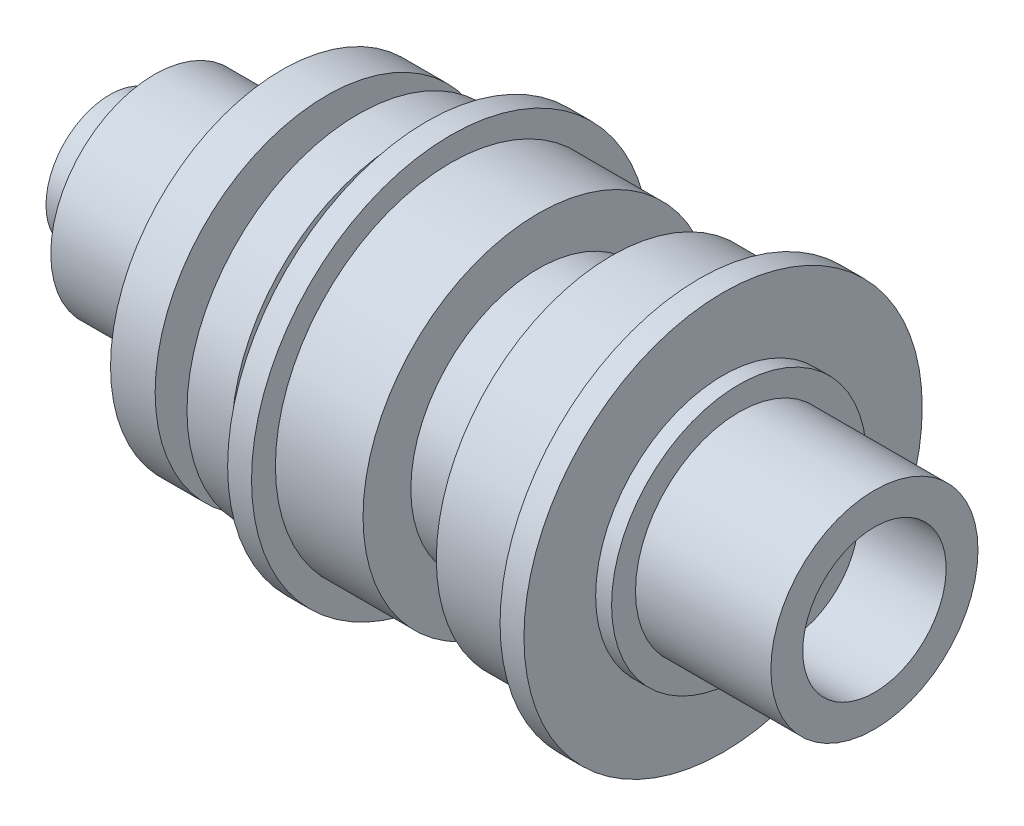
ISO-10303-21;
HEADER;
FILE_DESCRIPTION(('STEP AP214'),'2;1');
FILE_NAME('part.step','',(''),(''),'','','');
FILE_SCHEMA(('AUTOMOTIVE_DESIGN { 1 0 10303 214 1 1 1 1 }'));
ENDSEC;
DATA;
#1=APPLICATION_CONTEXT('core data for automotive mechanical design processes');
#2=APPLICATION_PROTOCOL_DEFINITION('international standard','automotive_design',2000,#1);
#3=PRODUCT_CONTEXT('',#1,'mechanical');
#4=PRODUCT('Part','Part','',(#3));
#5=PRODUCT_RELATED_PRODUCT_CATEGORY('part','',(#4));
#6=PRODUCT_DEFINITION_FORMATION('','',#4);
#7=PRODUCT_DEFINITION_CONTEXT('part definition',#1,'design');
#8=PRODUCT_DEFINITION('design','',#6,#7);
#9=PRODUCT_DEFINITION_SHAPE('','',#8);
#10=(LENGTH_UNIT() NAMED_UNIT(*) SI_UNIT(.MILLI.,.METRE.));
#11=(NAMED_UNIT(*) PLANE_ANGLE_UNIT() SI_UNIT($,.RADIAN.));
#12=(NAMED_UNIT(*) SI_UNIT($,.STERADIAN.) SOLID_ANGLE_UNIT());
#13=UNCERTAINTY_MEASURE_WITH_UNIT(LENGTH_MEASURE(1.E-05),#10,'distance_accuracy_value','');
#14=(GEOMETRIC_REPRESENTATION_CONTEXT(3) GLOBAL_UNCERTAINTY_ASSIGNED_CONTEXT((#13)) GLOBAL_UNIT_ASSIGNED_CONTEXT((#10,
#11,#12)) REPRESENTATION_CONTEXT('',''));
#15=CARTESIAN_POINT('',(0.,0.,0.));
#16=DIRECTION('',(0.,0.,1.));
#17=DIRECTION('',(1.,0.,0.));
#18=AXIS2_PLACEMENT_3D('',#15,#16,#17);
#19=CARTESIAN_POINT('',(-10.6952002257775,0.,0.));
#20=DIRECTION('',(-1.,0.,0.));
#21=DIRECTION('',(0.,0.,1.));
#22=AXIS2_PLACEMENT_3D('',#19,#20,#21);
#23=CYLINDRICAL_SURFACE('',#22,4.);
#24=CARTESIAN_POINT('',(0.,0.,0.));
#25=DIRECTION('',(-1.,0.,0.));
#26=DIRECTION('',(0.,0.,1.));
#27=AXIS2_PLACEMENT_3D('',#24,#25,#26);
#28=CIRCLE('',#27,4.);
#29=CARTESIAN_POINT('',(0.,0.,4.));
#30=VERTEX_POINT('',#29);
#31=EDGE_CURVE('E119',#30,#30,#28,.T.);
#32=ORIENTED_EDGE('',*,*,#31,.F.);
#33=EDGE_LOOP('',(#32));
#34=FACE_BOUND('',#33,.T.);
#35=CARTESIAN_POINT('',(2.8,0.,0.));
#36=DIRECTION('',(-1.,0.,0.));
#37=DIRECTION('',(0.,0.,1.));
#38=AXIS2_PLACEMENT_3D('',#35,#36,#37);
#39=CIRCLE('',#38,4.);
#40=CARTESIAN_POINT('',(2.8,0.,4.));
#41=VERTEX_POINT('',#40);
#42=EDGE_CURVE('E10',#41,#41,#39,.T.);
#43=ORIENTED_EDGE('',*,*,#42,.T.);
#44=EDGE_LOOP('',(#43));
#45=FACE_BOUND('',#44,.T.);
#46=ADVANCED_FACE('F31',(#34,#45),#23,.T.);
#47=CARTESIAN_POINT('',(2.8,6.5,0.));
#48=DIRECTION('',(1.,0.,0.));
#49=DIRECTION('',(0.,0.,-1.));
#50=AXIS2_PLACEMENT_3D('',#47,#48,#49);
#51=PLANE('',#50);
#52=ORIENTED_EDGE('',*,*,#42,.F.);
#53=EDGE_LOOP('',(#52));
#54=FACE_BOUND('',#53,.T.);
#55=CARTESIAN_POINT('',(2.8,0.,0.));
#56=DIRECTION('',(-1.,0.,0.));
#57=DIRECTION('',(0.,0.,1.));
#58=AXIS2_PLACEMENT_3D('',#55,#56,#57);
#59=CIRCLE('',#58,6.5);
#60=CARTESIAN_POINT('',(2.8,0.,6.5));
#61=VERTEX_POINT('',#60);
#62=EDGE_CURVE('E37',#61,#61,#59,.T.);
#63=ORIENTED_EDGE('',*,*,#62,.T.);
#64=EDGE_LOOP('',(#63));
#65=FACE_BOUND('',#64,.T.);
#66=ADVANCED_FACE('F126',(#54,#65),#51,.F.);
#67=CARTESIAN_POINT('',(-10.6952002257775,0.,0.));
#68=DIRECTION('',(-1.,0.,0.));
#69=DIRECTION('',(0.,0.,1.));
#70=AXIS2_PLACEMENT_3D('',#67,#68,#69);
#71=CYLINDRICAL_SURFACE('',#70,6.5);
#72=ORIENTED_EDGE('',*,*,#62,.F.);
#73=EDGE_LOOP('',(#72));
#74=FACE_BOUND('',#73,.T.);
#75=CARTESIAN_POINT('',(10.8,0.,0.));
#76=DIRECTION('',(-1.,0.,0.));
#77=DIRECTION('',(0.,0.,1.));
#78=AXIS2_PLACEMENT_3D('',#75,#76,#77);
#79=CIRCLE('',#78,6.5);
#80=CARTESIAN_POINT('',(10.8,0.,6.5));
#81=VERTEX_POINT('',#80);
#82=EDGE_CURVE('E41',#81,#81,#79,.T.);
#83=ORIENTED_EDGE('',*,*,#82,.T.);
#84=EDGE_LOOP('',(#83));
#85=FACE_BOUND('',#84,.T.);
#86=ADVANCED_FACE('F130',(#74,#85),#71,.T.);
#87=CARTESIAN_POINT('',(10.8,6.5,0.));
#88=DIRECTION('',(1.,0.,0.));
#89=DIRECTION('',(0.,0.,-1.));
#90=AXIS2_PLACEMENT_3D('',#87,#88,#89);
#91=PLANE('',#90);
#92=ORIENTED_EDGE('',*,*,#82,.F.);
#93=EDGE_LOOP('',(#92));
#94=FACE_BOUND('',#93,.T.);
#95=CARTESIAN_POINT('',(10.8,0.,0.));
#96=DIRECTION('',(-1.,0.,0.));
#97=DIRECTION('',(0.,0.,1.));
#98=AXIS2_PLACEMENT_3D('',#95,#96,#97);
#99=CIRCLE('',#98,10.75);
#100=CARTESIAN_POINT('',(10.8,0.,10.75));
#101=VERTEX_POINT('',#100);
#102=EDGE_CURVE('E45',#101,#101,#99,.T.);
#103=ORIENTED_EDGE('',*,*,#102,.T.);
#104=EDGE_LOOP('',(#103));
#105=FACE_BOUND('',#104,.T.);
#106=ADVANCED_FACE('F135',(#94,#105),#91,.F.);
#107=CARTESIAN_POINT('',(-10.6952002257775,0.,0.));
#108=DIRECTION('',(-1.,0.,0.));
#109=DIRECTION('',(0.,0.,1.));
#110=AXIS2_PLACEMENT_3D('',#107,#108,#109);
#111=CYLINDRICAL_SURFACE('',#110,10.75);
#112=ORIENTED_EDGE('',*,*,#102,.F.);
#113=EDGE_LOOP('',(#112));
#114=FACE_BOUND('',#113,.T.);
#115=CARTESIAN_POINT('',(13.6,0.,0.));
#116=DIRECTION('',(-1.,0.,0.));
#117=DIRECTION('',(0.,0.,1.));
#118=AXIS2_PLACEMENT_3D('',#115,#116,#117);
#119=CIRCLE('',#118,10.75);
#120=CARTESIAN_POINT('',(13.6,0.,10.75));
#121=VERTEX_POINT('',#120);
#122=EDGE_CURVE('E50',#121,#121,#119,.T.);
#123=ORIENTED_EDGE('',*,*,#122,.T.);
#124=EDGE_LOOP('',(#123));
#125=FACE_BOUND('',#124,.T.);
#126=ADVANCED_FACE('F141',(#114,#125),#111,.T.);
#127=CARTESIAN_POINT('',(13.6,10.75,0.));
#128=DIRECTION('',(-1.,0.,0.));
#129=DIRECTION('',(0.,0.,1.));
#130=AXIS2_PLACEMENT_3D('',#127,#128,#129);
#131=PLANE('',#130);
#132=ORIENTED_EDGE('',*,*,#122,.F.);
#133=EDGE_LOOP('',(#132));
#134=FACE_BOUND('',#133,.T.);
#135=CARTESIAN_POINT('',(13.6,0.,0.));
#136=DIRECTION('',(-1.,0.,0.));
#137=DIRECTION('',(0.,0.,1.));
#138=AXIS2_PLACEMENT_3D('',#135,#136,#137);
#139=CIRCLE('',#138,4.);
#140=CARTESIAN_POINT('',(13.6,0.,4.));
#141=VERTEX_POINT('',#140);
#142=EDGE_CURVE('E53',#141,#141,#139,.T.);
#143=ORIENTED_EDGE('',*,*,#142,.T.);
#144=EDGE_LOOP('',(#143));
#145=FACE_BOUND('',#144,.T.);
#146=ADVANCED_FACE('F145',(#134,#145),#131,.F.);
#147=CARTESIAN_POINT('',(-10.6952002257775,0.,0.));
#148=DIRECTION('',(-1.,0.,0.));
#149=DIRECTION('',(0.,0.,1.));
#150=AXIS2_PLACEMENT_3D('',#147,#148,#149);
#151=CYLINDRICAL_SURFACE('',#150,4.);
#152=ORIENTED_EDGE('',*,*,#142,.F.);
#153=EDGE_LOOP('',(#152));
#154=FACE_BOUND('',#153,.T.);
#155=CARTESIAN_POINT('',(15.6,0.,0.));
#156=DIRECTION('',(-1.,0.,0.));
#157=DIRECTION('',(0.,0.,1.));
#158=AXIS2_PLACEMENT_3D('',#155,#156,#157);
#159=CIRCLE('',#158,4.);
#160=CARTESIAN_POINT('',(15.6,0.,4.));
#161=VERTEX_POINT('',#160);
#162=EDGE_CURVE('E56',#161,#161,#159,.T.);
#163=ORIENTED_EDGE('',*,*,#162,.T.);
#164=EDGE_LOOP('',(#163));
#165=FACE_BOUND('',#164,.T.);
#166=ADVANCED_FACE('F149',(#154,#165),#151,.T.);
#167=CARTESIAN_POINT('',(15.6,4.,0.));
#168=DIRECTION('',(1.,0.,0.));
#169=DIRECTION('',(0.,0.,-1.));
#170=AXIS2_PLACEMENT_3D('',#167,#168,#169);
#171=PLANE('',#170);
#172=ORIENTED_EDGE('',*,*,#162,.F.);
#173=EDGE_LOOP('',(#172));
#174=FACE_BOUND('',#173,.T.);
#175=CARTESIAN_POINT('',(15.6,0.,0.));
#176=DIRECTION('',(-1.,0.,0.));
#177=DIRECTION('',(0.,0.,1.));
#178=AXIS2_PLACEMENT_3D('',#175,#176,#177);
#179=CIRCLE('',#178,10.75);
#180=CARTESIAN_POINT('',(15.6,0.,10.75));
#181=VERTEX_POINT('',#180);
#182=EDGE_CURVE('E59',#181,#181,#179,.T.);
#183=ORIENTED_EDGE('',*,*,#182,.T.);
#184=EDGE_LOOP('',(#183));
#185=FACE_BOUND('',#184,.T.);
#186=ADVANCED_FACE('F153',(#174,#185),#171,.F.);
#187=CARTESIAN_POINT('',(-10.6952002257775,0.,0.));
#188=DIRECTION('',(-1.,0.,0.));
#189=DIRECTION('',(0.,0.,1.));
#190=AXIS2_PLACEMENT_3D('',#187,#188,#189);
#191=CYLINDRICAL_SURFACE('',#190,10.75);
#192=ORIENTED_EDGE('',*,*,#182,.F.);
#193=EDGE_LOOP('',(#192));
#194=FACE_BOUND('',#193,.T.);
#195=CARTESIAN_POINT('',(18.4,0.,0.));
#196=DIRECTION('',(-1.,0.,0.));
#197=DIRECTION('',(0.,0.,1.));
#198=AXIS2_PLACEMENT_3D('',#195,#196,#197);
#199=CIRCLE('',#198,10.75);
#200=CARTESIAN_POINT('',(18.4,0.,10.75));
#201=VERTEX_POINT('',#200);
#202=EDGE_CURVE('E62',#201,#201,#199,.T.);
#203=ORIENTED_EDGE('',*,*,#202,.T.);
#204=EDGE_LOOP('',(#203));
#205=FACE_BOUND('',#204,.T.);
#206=ADVANCED_FACE('F157',(#194,#205),#191,.T.);
#207=CARTESIAN_POINT('',(18.4,10.75,0.));
#208=DIRECTION('',(-1.,0.,0.));
#209=DIRECTION('',(0.,0.,1.));
#210=AXIS2_PLACEMENT_3D('',#207,#208,#209);
#211=PLANE('',#210);
#212=ORIENTED_EDGE('',*,*,#202,.F.);
#213=EDGE_LOOP('',(#212));
#214=FACE_BOUND('',#213,.T.);
#215=CARTESIAN_POINT('',(18.4,0.,0.));
#216=DIRECTION('',(-1.,0.,0.));
#217=DIRECTION('',(0.,0.,1.));
#218=AXIS2_PLACEMENT_3D('',#215,#216,#217);
#219=CIRCLE('',#218,8.);
#220=CARTESIAN_POINT('',(18.4,0.,8.));
#221=VERTEX_POINT('',#220);
#222=EDGE_CURVE('E65',#221,#221,#219,.T.);
#223=ORIENTED_EDGE('',*,*,#222,.T.);
#224=EDGE_LOOP('',(#223));
#225=FACE_BOUND('',#224,.T.);
#226=ADVANCED_FACE('F161',(#214,#225),#211,.F.);
#227=CARTESIAN_POINT('',(-10.6952002257775,0.,0.));
#228=DIRECTION('',(-1.,0.,0.));
#229=DIRECTION('',(0.,0.,1.));
#230=AXIS2_PLACEMENT_3D('',#227,#228,#229);
#231=CYLINDRICAL_SURFACE('',#230,8.);
#232=ORIENTED_EDGE('',*,*,#222,.F.);
#233=EDGE_LOOP('',(#232));
#234=FACE_BOUND('',#233,.T.);
#235=CARTESIAN_POINT('',(19.9,0.,0.));
#236=DIRECTION('',(-1.,0.,0.));
#237=DIRECTION('',(0.,0.,1.));
#238=AXIS2_PLACEMENT_3D('',#235,#236,#237);
#239=CIRCLE('',#238,8.);
#240=CARTESIAN_POINT('',(19.9,0.,8.));
#241=VERTEX_POINT('',#240);
#242=EDGE_CURVE('E68',#241,#241,#239,.T.);
#243=ORIENTED_EDGE('',*,*,#242,.T.);
#244=EDGE_LOOP('',(#243));
#245=FACE_BOUND('',#244,.T.);
#246=ADVANCED_FACE('F165',(#234,#245),#231,.T.);
#247=CARTESIAN_POINT('',(19.9,8.,0.));
#248=DIRECTION('',(1.,0.,0.));
#249=DIRECTION('',(0.,0.,-1.));
#250=AXIS2_PLACEMENT_3D('',#247,#248,#249);
#251=PLANE('',#250);
#252=ORIENTED_EDGE('',*,*,#242,.F.);
#253=EDGE_LOOP('',(#252));
#254=FACE_BOUND('',#253,.T.);
#255=CARTESIAN_POINT('',(19.9,0.,0.));
#256=DIRECTION('',(-1.,0.,0.));
#257=DIRECTION('',(0.,0.,1.));
#258=AXIS2_PLACEMENT_3D('',#255,#256,#257);
#259=CIRCLE('',#258,12.5);
#260=CARTESIAN_POINT('',(19.9,0.,12.5));
#261=VERTEX_POINT('',#260);
#262=EDGE_CURVE('E71',#261,#261,#259,.T.);
#263=ORIENTED_EDGE('',*,*,#262,.T.);
#264=EDGE_LOOP('',(#263));
#265=FACE_BOUND('',#264,.T.);
#266=ADVANCED_FACE('F169',(#254,#265),#251,.F.);
#267=CARTESIAN_POINT('',(-10.6952002257775,0.,0.));
#268=DIRECTION('',(-1.,0.,0.));
#269=DIRECTION('',(0.,0.,1.));
#270=AXIS2_PLACEMENT_3D('',#267,#268,#269);
#271=CYLINDRICAL_SURFACE('',#270,12.5);
#272=ORIENTED_EDGE('',*,*,#262,.F.);
#273=EDGE_LOOP('',(#272));
#274=FACE_BOUND('',#273,.T.);
#275=CARTESIAN_POINT('',(21.4,0.,0.));
#276=DIRECTION('',(-1.,0.,0.));
#277=DIRECTION('',(0.,0.,1.));
#278=AXIS2_PLACEMENT_3D('',#275,#276,#277);
#279=CIRCLE('',#278,12.5);
#280=CARTESIAN_POINT('',(21.4,0.,12.5));
#281=VERTEX_POINT('',#280);
#282=EDGE_CURVE('E74',#281,#281,#279,.T.);
#283=ORIENTED_EDGE('',*,*,#282,.T.);
#284=EDGE_LOOP('',(#283));
#285=FACE_BOUND('',#284,.T.);
#286=ADVANCED_FACE('F173',(#274,#285),#271,.T.);
#287=CARTESIAN_POINT('',(21.4,12.5,0.));
#288=DIRECTION('',(-1.,0.,0.));
#289=DIRECTION('',(0.,0.,1.));
#290=AXIS2_PLACEMENT_3D('',#287,#288,#289);
#291=PLANE('',#290);
#292=ORIENTED_EDGE('',*,*,#282,.F.);
#293=EDGE_LOOP('',(#292));
#294=FACE_BOUND('',#293,.T.);
#295=CARTESIAN_POINT('',(21.4,0.,0.));
#296=DIRECTION('',(-1.,0.,0.));
#297=DIRECTION('',(0.,0.,1.));
#298=AXIS2_PLACEMENT_3D('',#295,#296,#297);
#299=CIRCLE('',#298,11.);
#300=CARTESIAN_POINT('',(21.4,0.,11.));
#301=VERTEX_POINT('',#300);
#302=EDGE_CURVE('E77',#301,#301,#299,.T.);
#303=ORIENTED_EDGE('',*,*,#302,.T.);
#304=EDGE_LOOP('',(#303));
#305=FACE_BOUND('',#304,.T.);
#306=ADVANCED_FACE('F177',(#294,#305),#291,.F.);
#307=CARTESIAN_POINT('',(-10.6952002257775,0.,0.));
#308=DIRECTION('',(-1.,0.,0.));
#309=DIRECTION('',(0.,0.,1.));
#310=AXIS2_PLACEMENT_3D('',#307,#308,#309);
#311=CYLINDRICAL_SURFACE('',#310,11.);
#312=ORIENTED_EDGE('',*,*,#302,.F.);
#313=EDGE_LOOP('',(#312));
#314=FACE_BOUND('',#313,.T.);
#315=CARTESIAN_POINT('',(26.9,0.,0.));
#316=DIRECTION('',(-1.,0.,0.));
#317=DIRECTION('',(0.,0.,1.));
#318=AXIS2_PLACEMENT_3D('',#315,#316,#317);
#319=CIRCLE('',#318,11.);
#320=CARTESIAN_POINT('',(26.9,0.,11.));
#321=VERTEX_POINT('',#320);
#322=EDGE_CURVE('E80',#321,#321,#319,.T.);
#323=ORIENTED_EDGE('',*,*,#322,.T.);
#324=EDGE_LOOP('',(#323));
#325=FACE_BOUND('',#324,.T.);
#326=ADVANCED_FACE('F181',(#314,#325),#311,.T.);
#327=CARTESIAN_POINT('',(26.9,11.,0.));
#328=DIRECTION('',(-1.,0.,0.));
#329=DIRECTION('',(0.,0.,1.));
#330=AXIS2_PLACEMENT_3D('',#327,#328,#329);
#331=PLANE('',#330);
#332=ORIENTED_EDGE('',*,*,#322,.F.);
#333=EDGE_LOOP('',(#332));
#334=FACE_BOUND('',#333,.T.);
#335=CARTESIAN_POINT('',(26.9,0.,0.));
#336=DIRECTION('',(-1.,0.,0.));
#337=DIRECTION('',(0.,0.,1.));
#338=AXIS2_PLACEMENT_3D('',#335,#336,#337);
#339=CIRCLE('',#338,8.);
#340=CARTESIAN_POINT('',(26.9,0.,8.));
#341=VERTEX_POINT('',#340);
#342=EDGE_CURVE('E83',#341,#341,#339,.T.);
#343=ORIENTED_EDGE('',*,*,#342,.T.);
#344=EDGE_LOOP('',(#343));
#345=FACE_BOUND('',#344,.T.);
#346=ADVANCED_FACE('F185',(#334,#345),#331,.F.);
#347=CARTESIAN_POINT('',(-10.6952002257775,0.,0.));
#348=DIRECTION('',(-1.,0.,0.));
#349=DIRECTION('',(0.,0.,1.));
#350=AXIS2_PLACEMENT_3D('',#347,#348,#349);
#351=CYLINDRICAL_SURFACE('',#350,8.);
#352=ORIENTED_EDGE('',*,*,#342,.F.);
#353=EDGE_LOOP('',(#352));
#354=FACE_BOUND('',#353,.T.);
#355=CARTESIAN_POINT('',(31.5,0.,0.));
#356=DIRECTION('',(-1.,0.,0.));
#357=DIRECTION('',(0.,0.,1.));
#358=AXIS2_PLACEMENT_3D('',#355,#356,#357);
#359=CIRCLE('',#358,8.);
#360=CARTESIAN_POINT('',(31.5,0.,8.));
#361=VERTEX_POINT('',#360);
#362=EDGE_CURVE('E86',#361,#361,#359,.T.);
#363=ORIENTED_EDGE('',*,*,#362,.T.);
#364=EDGE_LOOP('',(#363));
#365=FACE_BOUND('',#364,.T.);
#366=ADVANCED_FACE('F189',(#354,#365),#351,.T.);
#367=CARTESIAN_POINT('',(31.5,8.,0.));
#368=DIRECTION('',(1.,0.,0.));
#369=DIRECTION('',(0.,0.,-1.));
#370=AXIS2_PLACEMENT_3D('',#367,#368,#369);
#371=PLANE('',#370);
#372=ORIENTED_EDGE('',*,*,#362,.F.);
#373=EDGE_LOOP('',(#372));
#374=FACE_BOUND('',#373,.T.);
#375=CARTESIAN_POINT('',(31.5,0.,0.));
#376=DIRECTION('',(-1.,0.,0.));
#377=DIRECTION('',(0.,0.,1.));
#378=AXIS2_PLACEMENT_3D('',#375,#376,#377);
#379=CIRCLE('',#378,11.);
#380=CARTESIAN_POINT('',(31.5,0.,11.));
#381=VERTEX_POINT('',#380);
#382=EDGE_CURVE('E89',#381,#381,#379,.T.);
#383=ORIENTED_EDGE('',*,*,#382,.T.);
#384=EDGE_LOOP('',(#383));
#385=FACE_BOUND('',#384,.T.);
#386=ADVANCED_FACE('F193',(#374,#385),#371,.F.);
#387=CARTESIAN_POINT('',(-10.6952002257775,0.,0.));
#388=DIRECTION('',(-1.,0.,0.));
#389=DIRECTION('',(0.,0.,1.));
#390=AXIS2_PLACEMENT_3D('',#387,#388,#389);
#391=CYLINDRICAL_SURFACE('',#390,11.);
#392=ORIENTED_EDGE('',*,*,#382,.F.);
#393=EDGE_LOOP('',(#392));
#394=FACE_BOUND('',#393,.T.);
#395=CARTESIAN_POINT('',(37.,0.,0.));
#396=DIRECTION('',(-1.,0.,0.));
#397=DIRECTION('',(0.,0.,1.));
#398=AXIS2_PLACEMENT_3D('',#395,#396,#397);
#399=CIRCLE('',#398,11.);
#400=CARTESIAN_POINT('',(37.,0.,11.));
#401=VERTEX_POINT('',#400);
#402=EDGE_CURVE('E92',#401,#401,#399,.T.);
#403=ORIENTED_EDGE('',*,*,#402,.T.);
#404=EDGE_LOOP('',(#403));
#405=FACE_BOUND('',#404,.T.);
#406=ADVANCED_FACE('F197',(#394,#405),#391,.T.);
#407=CARTESIAN_POINT('',(37.,11.,0.));
#408=DIRECTION('',(1.,0.,0.));
#409=DIRECTION('',(0.,0.,-1.));
#410=AXIS2_PLACEMENT_3D('',#407,#408,#409);
#411=PLANE('',#410);
#412=ORIENTED_EDGE('',*,*,#402,.F.);
#413=EDGE_LOOP('',(#412));
#414=FACE_BOUND('',#413,.T.);
#415=CARTESIAN_POINT('',(37.,0.,0.));
#416=DIRECTION('',(-1.,0.,0.));
#417=DIRECTION('',(0.,0.,1.));
#418=AXIS2_PLACEMENT_3D('',#415,#416,#417);
#419=CIRCLE('',#418,12.5);
#420=CARTESIAN_POINT('',(37.,0.,12.5));
#421=VERTEX_POINT('',#420);
#422=EDGE_CURVE('E95',#421,#421,#419,.T.);
#423=ORIENTED_EDGE('',*,*,#422,.T.);
#424=EDGE_LOOP('',(#423));
#425=FACE_BOUND('',#424,.T.);
#426=ADVANCED_FACE('F201',(#414,#425),#411,.F.);
#427=CARTESIAN_POINT('',(-10.6952002257775,0.,0.));
#428=DIRECTION('',(-1.,0.,0.));
#429=DIRECTION('',(0.,0.,1.));
#430=AXIS2_PLACEMENT_3D('',#427,#428,#429);
#431=CYLINDRICAL_SURFACE('',#430,12.5);
#432=ORIENTED_EDGE('',*,*,#422,.F.);
#433=EDGE_LOOP('',(#432));
#434=FACE_BOUND('',#433,.T.);
#435=CARTESIAN_POINT('',(38.5,0.,0.));
#436=DIRECTION('',(-1.,0.,0.));
#437=DIRECTION('',(0.,0.,1.));
#438=AXIS2_PLACEMENT_3D('',#435,#436,#437);
#439=CIRCLE('',#438,12.5);
#440=CARTESIAN_POINT('',(38.5,0.,12.5));
#441=VERTEX_POINT('',#440);
#442=EDGE_CURVE('E98',#441,#441,#439,.T.);
#443=ORIENTED_EDGE('',*,*,#442,.T.);
#444=EDGE_LOOP('',(#443));
#445=FACE_BOUND('',#444,.T.);
#446=ADVANCED_FACE('F205',(#434,#445),#431,.T.);
#447=CARTESIAN_POINT('',(38.5,12.5,0.));
#448=DIRECTION('',(-1.,0.,0.));
#449=DIRECTION('',(0.,0.,1.));
#450=AXIS2_PLACEMENT_3D('',#447,#448,#449);
#451=PLANE('',#450);
#452=ORIENTED_EDGE('',*,*,#442,.F.);
#453=EDGE_LOOP('',(#452));
#454=FACE_BOUND('',#453,.T.);
#455=CARTESIAN_POINT('',(38.5,0.,0.));
#456=DIRECTION('',(-1.,0.,0.));
#457=DIRECTION('',(0.,0.,1.));
#458=AXIS2_PLACEMENT_3D('',#455,#456,#457);
#459=CIRCLE('',#458,8.);
#460=CARTESIAN_POINT('',(38.5,0.,8.));
#461=VERTEX_POINT('',#460);
#462=EDGE_CURVE('E101',#461,#461,#459,.T.);
#463=ORIENTED_EDGE('',*,*,#462,.T.);
#464=EDGE_LOOP('',(#463));
#465=FACE_BOUND('',#464,.T.);
#466=ADVANCED_FACE('F209',(#454,#465),#451,.F.);
#467=CARTESIAN_POINT('',(-10.6952002257775,0.,0.));
#468=DIRECTION('',(-1.,0.,0.));
#469=DIRECTION('',(0.,0.,1.));
#470=AXIS2_PLACEMENT_3D('',#467,#468,#469);
#471=CYLINDRICAL_SURFACE('',#470,8.);
#472=ORIENTED_EDGE('',*,*,#462,.F.);
#473=EDGE_LOOP('',(#472));
#474=FACE_BOUND('',#473,.T.);
#475=CARTESIAN_POINT('',(39.5,0.,0.));
#476=DIRECTION('',(-1.,0.,0.));
#477=DIRECTION('',(0.,0.,1.));
#478=AXIS2_PLACEMENT_3D('',#475,#476,#477);
#479=CIRCLE('',#478,8.);
#480=CARTESIAN_POINT('',(39.5,0.,8.));
#481=VERTEX_POINT('',#480);
#482=EDGE_CURVE('E104',#481,#481,#479,.T.);
#483=ORIENTED_EDGE('',*,*,#482,.T.);
#484=EDGE_LOOP('',(#483));
#485=FACE_BOUND('',#484,.T.);
#486=ADVANCED_FACE('F213',(#474,#485),#471,.T.);
#487=CARTESIAN_POINT('',(39.5,8.,0.));
#488=DIRECTION('',(-1.,0.,0.));
#489=DIRECTION('',(0.,0.,1.));
#490=AXIS2_PLACEMENT_3D('',#487,#488,#489);
#491=PLANE('',#490);
#492=ORIENTED_EDGE('',*,*,#482,.F.);
#493=EDGE_LOOP('',(#492));
#494=FACE_BOUND('',#493,.T.);
#495=CARTESIAN_POINT('',(39.5,0.,0.));
#496=DIRECTION('',(-1.,0.,0.));
#497=DIRECTION('',(0.,0.,1.));
#498=AXIS2_PLACEMENT_3D('',#495,#496,#497);
#499=CIRCLE('',#498,6.5);
#500=CARTESIAN_POINT('',(39.5,0.,6.5));
#501=VERTEX_POINT('',#500);
#502=EDGE_CURVE('E107',#501,#501,#499,.T.);
#503=ORIENTED_EDGE('',*,*,#502,.T.);
#504=EDGE_LOOP('',(#503));
#505=FACE_BOUND('',#504,.T.);
#506=ADVANCED_FACE('F217',(#494,#505),#491,.F.);
#507=CARTESIAN_POINT('',(-10.6952002257775,0.,0.));
#508=DIRECTION('',(-1.,0.,0.));
#509=DIRECTION('',(0.,0.,1.));
#510=AXIS2_PLACEMENT_3D('',#507,#508,#509);
#511=CYLINDRICAL_SURFACE('',#510,6.5);
#512=ORIENTED_EDGE('',*,*,#502,.F.);
#513=EDGE_LOOP('',(#512));
#514=FACE_BOUND('',#513,.T.);
#515=CARTESIAN_POINT('',(48.,0.,0.));
#516=DIRECTION('',(-1.,0.,0.));
#517=DIRECTION('',(0.,0.,1.));
#518=AXIS2_PLACEMENT_3D('',#515,#516,#517);
#519=CIRCLE('',#518,6.5);
#520=CARTESIAN_POINT('',(48.,0.,6.5));
#521=VERTEX_POINT('',#520);
#522=EDGE_CURVE('E110',#521,#521,#519,.T.);
#523=ORIENTED_EDGE('',*,*,#522,.T.);
#524=EDGE_LOOP('',(#523));
#525=FACE_BOUND('',#524,.T.);
#526=ADVANCED_FACE('F221',(#514,#525),#511,.T.);
#527=CARTESIAN_POINT('',(48.,6.5,0.));
#528=DIRECTION('',(-1.,0.,0.));
#529=DIRECTION('',(0.,0.,1.));
#530=AXIS2_PLACEMENT_3D('',#527,#528,#529);
#531=PLANE('',#530);
#532=ORIENTED_EDGE('',*,*,#522,.F.);
#533=EDGE_LOOP('',(#532));
#534=FACE_BOUND('',#533,.T.);
#535=CARTESIAN_POINT('',(48.,0.,0.));
#536=DIRECTION('',(-1.,0.,0.));
#537=DIRECTION('',(0.,0.,1.));
#538=AXIS2_PLACEMENT_3D('',#535,#536,#537);
#539=CIRCLE('',#538,4.5);
#540=CARTESIAN_POINT('',(48.,0.,4.5));
#541=VERTEX_POINT('',#540);
#542=EDGE_CURVE('E113',#541,#541,#539,.T.);
#543=ORIENTED_EDGE('',*,*,#542,.T.);
#544=EDGE_LOOP('',(#543));
#545=FACE_BOUND('',#544,.T.);
#546=ADVANCED_FACE('F225',(#534,#545),#531,.F.);
#547=CARTESIAN_POINT('',(-10.6952002257775,0.,0.));
#548=DIRECTION('',(-1.,0.,0.));
#549=DIRECTION('',(0.,0.,1.));
#550=AXIS2_PLACEMENT_3D('',#547,#548,#549);
#551=CYLINDRICAL_SURFACE('',#550,4.5);
#552=ORIENTED_EDGE('',*,*,#542,.F.);
#553=EDGE_LOOP('',(#552));
#554=FACE_BOUND('',#553,.T.);
#555=CARTESIAN_POINT('',(42.5,0.,0.));
#556=DIRECTION('',(-1.,0.,0.));
#557=DIRECTION('',(0.,0.,1.));
#558=AXIS2_PLACEMENT_3D('',#555,#556,#557);
#559=CIRCLE('',#558,4.5);
#560=CARTESIAN_POINT('',(42.5,0.,4.5));
#561=VERTEX_POINT('',#560);
#562=EDGE_CURVE('E116',#561,#561,#559,.T.);
#563=ORIENTED_EDGE('',*,*,#562,.T.);
#564=EDGE_LOOP('',(#563));
#565=FACE_BOUND('',#564,.T.);
#566=ADVANCED_FACE('F229',(#554,#565),#551,.F.);
#567=CARTESIAN_POINT('',(42.5,4.5,0.));
#568=DIRECTION('',(-1.,0.,0.));
#569=DIRECTION('',(0.,0.,1.));
#570=AXIS2_PLACEMENT_3D('',#567,#568,#569);
#571=PLANE('',#570);
#572=ORIENTED_EDGE('',*,*,#562,.F.);
#573=EDGE_LOOP('',(#572));
#574=FACE_BOUND('',#573,.T.);
#575=ADVANCED_FACE('F233',(#574),#571,.F.);
#576=CARTESIAN_POINT('',(0.,0.,0.));
#577=DIRECTION('',(1.,0.,0.));
#578=DIRECTION('',(0.,0.,-1.));
#579=AXIS2_PLACEMENT_3D('',#576,#577,#578);
#580=PLANE('',#579);
#581=ORIENTED_EDGE('',*,*,#31,.T.);
#582=EDGE_LOOP('',(#581));
#583=FACE_BOUND('',#582,.T.);
#584=ADVANCED_FACE('F123',(#583),#580,.F.);
#585=CLOSED_SHELL('',(#46,#66,#86,#106,#126,#146,#166,#186,#206,#226,#246,#266,#286,#306,#326,
#346,#366,#386,#406,#426,#446,#466,#486,#506,#526,#546,#566,#575,#584));
#586=MANIFOLD_SOLID_BREP('B2',#585);
#587=ADVANCED_BREP_SHAPE_REPRESENTATION('',(#18,#586),#14);
#588=SHAPE_DEFINITION_REPRESENTATION(#9,#587);
ENDSEC;
END-ISO-10303-21;
